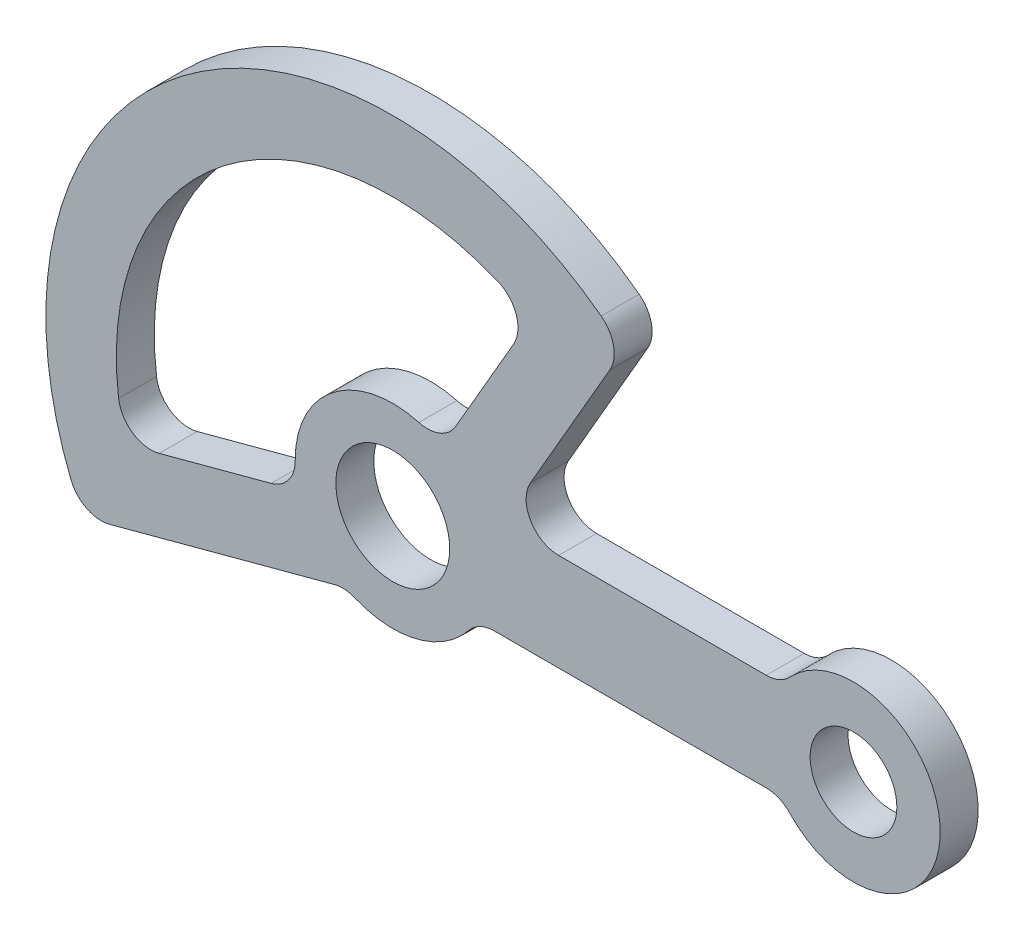
ISO-10303-21;
HEADER;
FILE_DESCRIPTION(('STEP AP214'),'2;1');
FILE_NAME('part.step','',(''),(''),'','','');
FILE_SCHEMA(('AUTOMOTIVE_DESIGN { 1 0 10303 214 1 1 1 1 }'));
ENDSEC;
DATA;
#1=APPLICATION_CONTEXT('core data for automotive mechanical design processes');
#2=APPLICATION_PROTOCOL_DEFINITION('international standard','automotive_design',2000,#1);
#3=PRODUCT_CONTEXT('',#1,'mechanical');
#4=PRODUCT('Part','Part','',(#3));
#5=PRODUCT_RELATED_PRODUCT_CATEGORY('part','',(#4));
#6=PRODUCT_DEFINITION_FORMATION('','',#4);
#7=PRODUCT_DEFINITION_CONTEXT('part definition',#1,'design');
#8=PRODUCT_DEFINITION('design','',#6,#7);
#9=PRODUCT_DEFINITION_SHAPE('','',#8);
#10=(LENGTH_UNIT() NAMED_UNIT(*) SI_UNIT(.MILLI.,.METRE.));
#11=(NAMED_UNIT(*) PLANE_ANGLE_UNIT() SI_UNIT($,.RADIAN.));
#12=(NAMED_UNIT(*) SI_UNIT($,.STERADIAN.) SOLID_ANGLE_UNIT());
#13=UNCERTAINTY_MEASURE_WITH_UNIT(LENGTH_MEASURE(1.E-05),#10,'distance_accuracy_value','');
#14=(GEOMETRIC_REPRESENTATION_CONTEXT(3) GLOBAL_UNCERTAINTY_ASSIGNED_CONTEXT((#13)) GLOBAL_UNIT_ASSIGNED_CONTEXT((#10,
#11,#12)) REPRESENTATION_CONTEXT('',''));
#15=CARTESIAN_POINT('',(0.,0.,0.));
#16=DIRECTION('',(0.,0.,1.));
#17=DIRECTION('',(1.,0.,0.));
#18=AXIS2_PLACEMENT_3D('',#15,#16,#17);
#19=CARTESIAN_POINT('',(68.9065230605689,15.,7.));
#20=DIRECTION('',(0.,0.,1.));
#21=DIRECTION('',(1.,0.,0.));
#22=AXIS2_PLACEMENT_3D('',#19,#20,#21);
#23=PLANE('',#22);
#24=DIRECTION('',(0.500000000000001,0.866025403784438,0.));
#25=VECTOR('',#24,1.);
#26=CARTESIAN_POINT('',(11.6189500386223,20.1246117974981,7.));
#27=LINE('',#26,#25);
#28=CARTESIAN_POINT('',(11.6189500386223,20.1246117974981,7.));
#29=VERTEX_POINT('',#28);
#30=CARTESIAN_POINT('',(22.2991031209778,38.6231795687512,7.));
#31=VERTEX_POINT('',#30);
#32=EDGE_CURVE('E200',#29,#31,#27,.T.);
#33=ORIENTED_EDGE('',*,*,#32,.F.);
#34=CARTESIAN_POINT('',(6.42279761591565,23.1246117974981,7.));
#35=DIRECTION('',(0.,0.,1.));
#36=DIRECTION('',(1.,0.,0.));
#37=AXIS2_PLACEMENT_3D('',#34,#35,#36);
#38=CIRCLE('',#37,6.);
#39=CARTESIAN_POINT('',(4.81709821193674,17.3434588481236,7.));
#40=VERTEX_POINT('',#39);
#41=EDGE_CURVE('E192',#40,#29,#38,.T.);
#42=ORIENTED_EDGE('',*,*,#41,.F.);
#43=CARTESIAN_POINT('',(0.,0.,7.));
#44=DIRECTION('',(0.,0.,-1.));
#45=DIRECTION('',(1.,0.,0.));
#46=AXIS2_PLACEMENT_3D('',#43,#44,#45);
#47=CIRCLE('',#46,18.);
#48=CARTESIAN_POINT('',(-17.9992515779627,-0.164142112834368,7.));
#49=VERTEX_POINT('',#48);
#50=EDGE_CURVE('E227',#49,#40,#47,.T.);
#51=ORIENTED_EDGE('',*,*,#50,.F.);
#52=CARTESIAN_POINT('',(-23.9990021039503,-0.218856150445824,7.));
#53=DIRECTION('',(0.,0.,1.));
#54=DIRECTION('',(1.,0.,0.));
#55=AXIS2_PLACEMENT_3D('',#52,#53,#54);
#56=CIRCLE('',#55,6.);
#57=CARTESIAN_POINT('',(-22.4460878333352,-6.01441110818023,7.));
#58=VERTEX_POINT('',#57);
#59=EDGE_CURVE('E225',#58,#49,#56,.T.);
#60=ORIENTED_EDGE('',*,*,#59,.F.);
#61=DIRECTION('',(0.965925826289068,0.258819045102522,0.));
#62=VECTOR('',#61,1.);
#63=CARTESIAN_POINT('',(-22.4460878333352,-6.01441110818023,7.));
#64=LINE('',#63,#62);
#65=CARTESIAN_POINT('',(-43.0785592152712,-11.5428651528282,7.));
#66=VERTEX_POINT('',#65);
#67=EDGE_CURVE('E223',#66,#58,#64,.T.);
#68=ORIENTED_EDGE('',*,*,#67,.F.);
#69=CARTESIAN_POINT('',(-44.6314734858863,-5.74731019509384,7.));
#70=DIRECTION('',(0.,0.,1.));
#71=DIRECTION('',(-1.,0.,0.));
#72=AXIS2_PLACEMENT_3D('',#69,#70,#71);
#73=CIRCLE('',#72,6.);
#74=CARTESIAN_POINT('',(-50.5823366173378,-6.51361822110635,7.));
#75=VERTEX_POINT('',#74);
#76=EDGE_CURVE('E221',#75,#66,#73,.T.);
#77=ORIENTED_EDGE('',*,*,#76,.F.);
#78=CARTESIAN_POINT('',(0.,0.,7.));
#79=DIRECTION('',(0.,0.,1.));
#80=DIRECTION('',(1.,0.,0.));
#81=AXIS2_PLACEMENT_3D('',#78,#79,#80);
#82=CIRCLE('',#81,51.);
#83=CARTESIAN_POINT('',(19.3833441247073,47.1729368445847,7.));
#84=VERTEX_POINT('',#83);
#85=EDGE_CURVE('E216',#84,#75,#82,.T.);
#86=ORIENTED_EDGE('',*,*,#85,.F.);
#87=CARTESIAN_POINT('',(17.1029506982712,41.6231795687512,7.));
#88=DIRECTION('',(0.,0.,1.));
#89=DIRECTION('',(1.,0.,0.));
#90=AXIS2_PLACEMENT_3D('',#87,#88,#89);
#91=CIRCLE('',#90,6.);
#92=EDGE_CURVE('E214',#31,#84,#91,.T.);
#93=ORIENTED_EDGE('',*,*,#92,.F.);
#94=EDGE_LOOP('',(#33,#42,#51,#60,#68,#77,#86,#93));
#95=FACE_BOUND('',#94,.T.);
#96=CARTESIAN_POINT('',(0.,0.,7.));
#97=DIRECTION('',(0.,0.,1.));
#98=DIRECTION('',(1.,0.,0.));
#99=AXIS2_PLACEMENT_3D('',#96,#97,#98);
#100=CIRCLE('',#99,10.5);
#101=CARTESIAN_POINT('',(10.5,0.,7.));
#102=VERTEX_POINT('',#101);
#103=EDGE_CURVE('E260',#102,#102,#100,.T.);
#104=ORIENTED_EDGE('',*,*,#103,.F.);
#105=EDGE_LOOP('',(#104));
#106=FACE_BOUND('',#105,.T.);
#107=CARTESIAN_POINT('',(68.9065230605689,15.,7.));
#108=DIRECTION('',(0.,0.,-1.));
#109=DIRECTION('',(1.,0.,0.));
#110=AXIS2_PLACEMENT_3D('',#107,#108,#109);
#111=CIRCLE('',#110,6.);
#112=CARTESIAN_POINT('',(73.2956531349592,10.9090909090909,7.));
#113=VERTEX_POINT('',#112);
#114=CARTESIAN_POINT('',(68.9065230605689,9.,7.));
#115=VERTEX_POINT('',#114);
#116=EDGE_CURVE('E266',#113,#115,#111,.T.);
#117=ORIENTED_EDGE('',*,*,#116,.T.);
#118=DIRECTION('',(-1.,0.,0.));
#119=VECTOR('',#118,1.);
#120=CARTESIAN_POINT('',(68.9065230605689,9.,7.));
#121=LINE('',#120,#119);
#122=CARTESIAN_POINT('',(30.5995642670503,8.99999999999999,7.));
#123=VERTEX_POINT('',#122);
#124=EDGE_CURVE('E269',#115,#123,#121,.T.);
#125=ORIENTED_EDGE('',*,*,#124,.T.);
#126=CARTESIAN_POINT('',(30.5995642670502,15.,7.));
#127=DIRECTION('',(0.,0.,-1.));
#128=DIRECTION('',(1.,0.,0.));
#129=AXIS2_PLACEMENT_3D('',#126,#127,#128);
#130=CIRCLE('',#129,6.);
#131=CARTESIAN_POINT('',(25.4034118443436,18.0000000000001,7.));
#132=VERTEX_POINT('',#131);
#133=EDGE_CURVE('E272',#123,#132,#130,.T.);
#134=ORIENTED_EDGE('',*,*,#133,.T.);
#135=DIRECTION('',(0.5,0.866025403784439,0.));
#136=VECTOR('',#135,1.);
#137=CARTESIAN_POINT('',(25.4034118443436,18.0000000000001,7.));
#138=LINE('',#137,#136);
#139=CARTESIAN_POINT('',(40.0463485901673,43.362310415784,7.));
#140=VERTEX_POINT('',#139);
#141=EDGE_CURVE('E274',#132,#140,#138,.T.);
#142=ORIENTED_EDGE('',*,*,#141,.T.);
#143=CARTESIAN_POINT('',(34.8501961674606,46.362310415784,7.));
#144=DIRECTION('',(0.,0.,1.));
#145=DIRECTION('',(1.,0.,0.));
#146=AXIS2_PLACEMENT_3D('',#143,#144,#145);
#147=CIRCLE('',#146,6.00000000000001);
#148=CARTESIAN_POINT('',(38.4553888744393,51.1584114932789,7.));
#149=VERTEX_POINT('',#148);
#150=EDGE_CURVE('E276',#140,#149,#147,.T.);
#151=ORIENTED_EDGE('',*,*,#150,.T.);
#152=CARTESIAN_POINT('',(0.,0.,7.));
#153=DIRECTION('',(0.,0.,1.));
#154=DIRECTION('',(1.,0.,0.));
#155=AXIS2_PLACEMENT_3D('',#152,#153,#154);
#156=CIRCLE('',#155,64.);
#157=CARTESIAN_POINT('',(-59.3682179208101,-23.904282062158,7.));
#158=VERTEX_POINT('',#157);
#159=EDGE_CURVE('E278',#149,#158,#156,.T.);
#160=ORIENTED_EDGE('',*,*,#159,.T.);
#161=CARTESIAN_POINT('',(-53.8024474907341,-21.6632556188307,7.));
#162=DIRECTION('',(0.,0.,1.));
#163=DIRECTION('',(1.,0.,0.));
#164=AXIS2_PLACEMENT_3D('',#161,#162,#163);
#165=CIRCLE('',#164,5.99999999999999);
#166=CARTESIAN_POINT('',(-52.249533220119,-27.4588105765651,7.));
#167=VERTEX_POINT('',#166);
#168=EDGE_CURVE('E280',#158,#167,#165,.T.);
#169=ORIENTED_EDGE('',*,*,#168,.T.);
#170=DIRECTION('',(0.965925826289068,0.258819045102522,0.));
#171=VECTOR('',#170,1.);
#172=CARTESIAN_POINT('',(-10.7986052500331,-16.35206790146,7.));
#173=LINE('',#172,#171);
#174=CARTESIAN_POINT('',(-10.7986052500331,-16.35206790146,7.));
#175=VERTEX_POINT('',#174);
#176=EDGE_CURVE('E282',#167,#175,#173,.T.);
#177=ORIENTED_EDGE('',*,*,#176,.T.);
#178=CARTESIAN_POINT('',(-9.245690979418,-22.1476228591944,7.));
#179=DIRECTION('',(0.,0.,-1.));
#180=DIRECTION('',(-1.,0.,0.));
#181=AXIS2_PLACEMENT_3D('',#178,#179,#180);
#182=CIRCLE('',#181,6.00000000000001);
#183=CARTESIAN_POINT('',(-6.9342682345635,-16.6107171443958,7.));
#184=VERTEX_POINT('',#183);
#185=EDGE_CURVE('E284',#175,#184,#182,.T.);
#186=ORIENTED_EDGE('',*,*,#185,.T.);
#187=CARTESIAN_POINT('',(0.,0.,7.));
#188=DIRECTION('',(0.,0.,1.));
#189=DIRECTION('',(1.,0.,0.));
#190=AXIS2_PLACEMENT_3D('',#187,#188,#189);
#191=CIRCLE('',#190,18.);
#192=CARTESIAN_POINT('',(14.0512454963964,-11.25,7.));
#193=VERTEX_POINT('',#192);
#194=EDGE_CURVE('E286',#184,#193,#191,.T.);
#195=ORIENTED_EDGE('',*,*,#194,.T.);
#196=CARTESIAN_POINT('',(18.7349939951952,-15.,7.));
#197=DIRECTION('',(0.,0.,-1.));
#198=DIRECTION('',(-1.,0.,0.));
#199=AXIS2_PLACEMENT_3D('',#196,#197,#198);
#200=CIRCLE('',#199,6.);
#201=CARTESIAN_POINT('',(18.7349939951952,-9.,7.));
#202=VERTEX_POINT('',#201);
#203=EDGE_CURVE('E288',#193,#202,#200,.T.);
#204=ORIENTED_EDGE('',*,*,#203,.T.);
#205=DIRECTION('',(1.,0.,0.));
#206=VECTOR('',#205,1.);
#207=CARTESIAN_POINT('',(68.9065230605689,-9.,7.));
#208=LINE('',#207,#206);
#209=CARTESIAN_POINT('',(68.9065230605689,-8.99999999999999,7.));
#210=VERTEX_POINT('',#209);
#211=EDGE_CURVE('E290',#202,#210,#208,.T.);
#212=ORIENTED_EDGE('',*,*,#211,.T.);
#213=CARTESIAN_POINT('',(68.9065230605689,-15.,7.));
#214=DIRECTION('',(0.,0.,-1.));
#215=DIRECTION('',(-1.,0.,0.));
#216=AXIS2_PLACEMENT_3D('',#213,#214,#215);
#217=CIRCLE('',#216,6.);
#218=CARTESIAN_POINT('',(73.2956531349592,-10.9090909090909,7.));
#219=VERTEX_POINT('',#218);
#220=EDGE_CURVE('E292',#210,#219,#217,.T.);
#221=ORIENTED_EDGE('',*,*,#220,.T.);
#222=CARTESIAN_POINT('',(85.,0.,7.));
#223=DIRECTION('',(0.,0.,1.));
#224=DIRECTION('',(1.,0.,0.));
#225=AXIS2_PLACEMENT_3D('',#222,#223,#224);
#226=CIRCLE('',#225,16.);
#227=EDGE_CURVE('E294',#219,#113,#226,.T.);
#228=ORIENTED_EDGE('',*,*,#227,.T.);
#229=EDGE_LOOP('',(#117,#125,#134,#142,#151,#160,#169,#177,#186,#195,#204,#212,#221,#228));
#230=FACE_BOUND('',#229,.T.);
#231=CARTESIAN_POINT('',(85.,0.,7.));
#232=DIRECTION('',(0.,0.,1.));
#233=DIRECTION('',(1.,0.,0.));
#234=AXIS2_PLACEMENT_3D('',#231,#232,#233);
#235=CIRCLE('',#234,8.00000000000001);
#236=CARTESIAN_POINT('',(93.,0.,7.));
#237=VERTEX_POINT('',#236);
#238=EDGE_CURVE('E230',#237,#237,#235,.T.);
#239=ORIENTED_EDGE('',*,*,#238,.F.);
#240=EDGE_LOOP('',(#239));
#241=FACE_BOUND('',#240,.T.);
#242=ADVANCED_FACE('F43',(#95,#106,#230,#241),#23,.T.);
#243=CARTESIAN_POINT('',(68.9065230605689,15.,0.));
#244=DIRECTION('',(0.,0.,1.));
#245=DIRECTION('',(1.,0.,0.));
#246=AXIS2_PLACEMENT_3D('',#243,#244,#245);
#247=PLANE('',#246);
#248=CARTESIAN_POINT('',(0.,0.,0.));
#249=DIRECTION('',(0.,0.,1.));
#250=DIRECTION('',(1.,0.,0.));
#251=AXIS2_PLACEMENT_3D('',#248,#249,#250);
#252=CIRCLE('',#251,10.5);
#253=CARTESIAN_POINT('',(10.5,0.,0.));
#254=VERTEX_POINT('',#253);
#255=EDGE_CURVE('E208',#254,#254,#252,.T.);
#256=ORIENTED_EDGE('',*,*,#255,.T.);
#257=EDGE_LOOP('',(#256));
#258=FACE_BOUND('',#257,.T.);
#259=CARTESIAN_POINT('',(68.9065230605689,15.,0.));
#260=DIRECTION('',(0.,0.,-1.));
#261=DIRECTION('',(1.,0.,0.));
#262=AXIS2_PLACEMENT_3D('',#259,#260,#261);
#263=CIRCLE('',#262,6.);
#264=CARTESIAN_POINT('',(73.2956531349592,10.9090909090909,0.));
#265=VERTEX_POINT('',#264);
#266=CARTESIAN_POINT('',(68.9065230605689,9.,0.));
#267=VERTEX_POINT('',#266);
#268=EDGE_CURVE('E263',#265,#267,#263,.T.);
#269=ORIENTED_EDGE('',*,*,#268,.F.);
#270=CARTESIAN_POINT('',(85.,0.,0.));
#271=DIRECTION('',(0.,0.,1.));
#272=DIRECTION('',(1.,0.,0.));
#273=AXIS2_PLACEMENT_3D('',#270,#271,#272);
#274=CIRCLE('',#273,16.);
#275=CARTESIAN_POINT('',(73.2956531349592,-10.9090909090909,0.));
#276=VERTEX_POINT('',#275);
#277=EDGE_CURVE('E270',#276,#265,#274,.T.);
#278=ORIENTED_EDGE('',*,*,#277,.F.);
#279=CARTESIAN_POINT('',(68.9065230605689,-15.,0.));
#280=DIRECTION('',(0.,0.,-1.));
#281=DIRECTION('',(-1.,0.,0.));
#282=AXIS2_PLACEMENT_3D('',#279,#280,#281);
#283=CIRCLE('',#282,6.);
#284=CARTESIAN_POINT('',(68.9065230605689,-8.99999999999999,0.));
#285=VERTEX_POINT('',#284);
#286=EDGE_CURVE('E321',#285,#276,#283,.T.);
#287=ORIENTED_EDGE('',*,*,#286,.F.);
#288=DIRECTION('',(1.,0.,0.));
#289=VECTOR('',#288,1.);
#290=CARTESIAN_POINT('',(68.9065230605689,-9.,0.));
#291=LINE('',#290,#289);
#292=CARTESIAN_POINT('',(18.7349939951952,-9.,0.));
#293=VERTEX_POINT('',#292);
#294=EDGE_CURVE('E319',#293,#285,#291,.T.);
#295=ORIENTED_EDGE('',*,*,#294,.F.);
#296=CARTESIAN_POINT('',(18.7349939951952,-15.,0.));
#297=DIRECTION('',(0.,0.,-1.));
#298=DIRECTION('',(-1.,0.,0.));
#299=AXIS2_PLACEMENT_3D('',#296,#297,#298);
#300=CIRCLE('',#299,6.);
#301=CARTESIAN_POINT('',(14.0512454963964,-11.25,0.));
#302=VERTEX_POINT('',#301);
#303=EDGE_CURVE('E317',#302,#293,#300,.T.);
#304=ORIENTED_EDGE('',*,*,#303,.F.);
#305=CARTESIAN_POINT('',(0.,0.,0.));
#306=DIRECTION('',(0.,0.,1.));
#307=DIRECTION('',(1.,0.,0.));
#308=AXIS2_PLACEMENT_3D('',#305,#306,#307);
#309=CIRCLE('',#308,18.);
#310=CARTESIAN_POINT('',(-6.9342682345635,-16.6107171443958,0.));
#311=VERTEX_POINT('',#310);
#312=EDGE_CURVE('E315',#311,#302,#309,.T.);
#313=ORIENTED_EDGE('',*,*,#312,.F.);
#314=CARTESIAN_POINT('',(-9.245690979418,-22.1476228591944,0.));
#315=DIRECTION('',(0.,0.,-1.));
#316=DIRECTION('',(-1.,0.,0.));
#317=AXIS2_PLACEMENT_3D('',#314,#315,#316);
#318=CIRCLE('',#317,6.00000000000001);
#319=CARTESIAN_POINT('',(-10.7986052500331,-16.35206790146,0.));
#320=VERTEX_POINT('',#319);
#321=EDGE_CURVE('E313',#320,#311,#318,.T.);
#322=ORIENTED_EDGE('',*,*,#321,.F.);
#323=DIRECTION('',(0.965925826289068,0.258819045102522,0.));
#324=VECTOR('',#323,1.);
#325=CARTESIAN_POINT('',(-10.7986052500331,-16.35206790146,0.));
#326=LINE('',#325,#324);
#327=CARTESIAN_POINT('',(-52.249533220119,-27.4588105765651,0.));
#328=VERTEX_POINT('',#327);
#329=EDGE_CURVE('E311',#328,#320,#326,.T.);
#330=ORIENTED_EDGE('',*,*,#329,.F.);
#331=CARTESIAN_POINT('',(-53.8024474907341,-21.6632556188307,0.));
#332=DIRECTION('',(0.,0.,1.));
#333=DIRECTION('',(1.,0.,0.));
#334=AXIS2_PLACEMENT_3D('',#331,#332,#333);
#335=CIRCLE('',#334,5.99999999999999);
#336=CARTESIAN_POINT('',(-59.3682179208101,-23.904282062158,0.));
#337=VERTEX_POINT('',#336);
#338=EDGE_CURVE('E309',#337,#328,#335,.T.);
#339=ORIENTED_EDGE('',*,*,#338,.F.);
#340=CARTESIAN_POINT('',(0.,0.,0.));
#341=DIRECTION('',(0.,0.,1.));
#342=DIRECTION('',(1.,0.,0.));
#343=AXIS2_PLACEMENT_3D('',#340,#341,#342);
#344=CIRCLE('',#343,64.);
#345=CARTESIAN_POINT('',(38.4553888744393,51.1584114932789,0.));
#346=VERTEX_POINT('',#345);
#347=EDGE_CURVE('E307',#346,#337,#344,.T.);
#348=ORIENTED_EDGE('',*,*,#347,.F.);
#349=CARTESIAN_POINT('',(34.8501961674606,46.362310415784,0.));
#350=DIRECTION('',(0.,0.,1.));
#351=DIRECTION('',(1.,0.,0.));
#352=AXIS2_PLACEMENT_3D('',#349,#350,#351);
#353=CIRCLE('',#352,6.00000000000001);
#354=CARTESIAN_POINT('',(40.0463485901673,43.362310415784,0.));
#355=VERTEX_POINT('',#354);
#356=EDGE_CURVE('E305',#355,#346,#353,.T.);
#357=ORIENTED_EDGE('',*,*,#356,.F.);
#358=DIRECTION('',(0.5,0.866025403784439,0.));
#359=VECTOR('',#358,1.);
#360=CARTESIAN_POINT('',(25.4034118443436,18.0000000000001,0.));
#361=LINE('',#360,#359);
#362=CARTESIAN_POINT('',(25.4034118443436,18.0000000000001,0.));
#363=VERTEX_POINT('',#362);
#364=EDGE_CURVE('E303',#363,#355,#361,.T.);
#365=ORIENTED_EDGE('',*,*,#364,.F.);
#366=CARTESIAN_POINT('',(30.5995642670502,15.,0.));
#367=DIRECTION('',(0.,0.,-1.));
#368=DIRECTION('',(1.,0.,0.));
#369=AXIS2_PLACEMENT_3D('',#366,#367,#368);
#370=CIRCLE('',#369,6.);
#371=CARTESIAN_POINT('',(30.5995642670503,8.99999999999999,0.));
#372=VERTEX_POINT('',#371);
#373=EDGE_CURVE('E301',#372,#363,#370,.T.);
#374=ORIENTED_EDGE('',*,*,#373,.F.);
#375=DIRECTION('',(-1.,0.,0.));
#376=VECTOR('',#375,1.);
#377=CARTESIAN_POINT('',(68.9065230605689,9.,0.));
#378=LINE('',#377,#376);
#379=EDGE_CURVE('E299',#267,#372,#378,.T.);
#380=ORIENTED_EDGE('',*,*,#379,.F.);
#381=EDGE_LOOP('',(#269,#278,#287,#295,#304,#313,#322,#330,#339,#348,#357,#365,#374,#380));
#382=FACE_BOUND('',#381,.T.);
#383=CARTESIAN_POINT('',(6.42279761591565,23.1246117974981,0.));
#384=DIRECTION('',(0.,0.,1.));
#385=DIRECTION('',(1.,0.,0.));
#386=AXIS2_PLACEMENT_3D('',#383,#384,#385);
#387=CIRCLE('',#386,6.);
#388=CARTESIAN_POINT('',(4.81709821193674,17.3434588481236,0.));
#389=VERTEX_POINT('',#388);
#390=CARTESIAN_POINT('',(11.6189500386223,20.1246117974981,0.));
#391=VERTEX_POINT('',#390);
#392=EDGE_CURVE('E66',#389,#391,#387,.T.);
#393=ORIENTED_EDGE('',*,*,#392,.T.);
#394=DIRECTION('',(0.500000000000001,0.866025403784438,0.));
#395=VECTOR('',#394,1.);
#396=CARTESIAN_POINT('',(11.6189500386223,20.1246117974981,0.));
#397=LINE('',#396,#395);
#398=CARTESIAN_POINT('',(22.2991031209778,38.6231795687512,0.));
#399=VERTEX_POINT('',#398);
#400=EDGE_CURVE('E207',#391,#399,#397,.T.);
#401=ORIENTED_EDGE('',*,*,#400,.T.);
#402=CARTESIAN_POINT('',(17.1029506982712,41.6231795687512,0.));
#403=DIRECTION('',(0.,0.,1.));
#404=DIRECTION('',(1.,0.,0.));
#405=AXIS2_PLACEMENT_3D('',#402,#403,#404);
#406=CIRCLE('',#405,6.);
#407=CARTESIAN_POINT('',(19.3833441247073,47.1729368445847,0.));
#408=VERTEX_POINT('',#407);
#409=EDGE_CURVE('E232',#399,#408,#406,.T.);
#410=ORIENTED_EDGE('',*,*,#409,.T.);
#411=CARTESIAN_POINT('',(0.,0.,0.));
#412=DIRECTION('',(0.,0.,1.));
#413=DIRECTION('',(1.,0.,0.));
#414=AXIS2_PLACEMENT_3D('',#411,#412,#413);
#415=CIRCLE('',#414,51.);
#416=CARTESIAN_POINT('',(-50.5823366173378,-6.51361822110635,0.));
#417=VERTEX_POINT('',#416);
#418=EDGE_CURVE('E235',#408,#417,#415,.T.);
#419=ORIENTED_EDGE('',*,*,#418,.T.);
#420=CARTESIAN_POINT('',(-44.6314734858863,-5.74731019509384,0.));
#421=DIRECTION('',(0.,0.,1.));
#422=DIRECTION('',(-1.,0.,0.));
#423=AXIS2_PLACEMENT_3D('',#420,#421,#422);
#424=CIRCLE('',#423,6.);
#425=CARTESIAN_POINT('',(-43.0785592152712,-11.5428651528282,0.));
#426=VERTEX_POINT('',#425);
#427=EDGE_CURVE('E238',#417,#426,#424,.T.);
#428=ORIENTED_EDGE('',*,*,#427,.T.);
#429=DIRECTION('',(0.965925826289068,0.258819045102522,0.));
#430=VECTOR('',#429,1.);
#431=CARTESIAN_POINT('',(-22.4460878333352,-6.01441110818023,0.));
#432=LINE('',#431,#430);
#433=CARTESIAN_POINT('',(-22.4460878333352,-6.01441110818023,0.));
#434=VERTEX_POINT('',#433);
#435=EDGE_CURVE('E241',#426,#434,#432,.T.);
#436=ORIENTED_EDGE('',*,*,#435,.T.);
#437=CARTESIAN_POINT('',(-23.9990021039503,-0.218856150445824,0.));
#438=DIRECTION('',(0.,0.,1.));
#439=DIRECTION('',(1.,0.,0.));
#440=AXIS2_PLACEMENT_3D('',#437,#438,#439);
#441=CIRCLE('',#440,6.);
#442=CARTESIAN_POINT('',(-17.9992515779627,-0.164142112834368,0.));
#443=VERTEX_POINT('',#442);
#444=EDGE_CURVE('E244',#434,#443,#441,.T.);
#445=ORIENTED_EDGE('',*,*,#444,.T.);
#446=CARTESIAN_POINT('',(0.,0.,0.));
#447=DIRECTION('',(0.,0.,-1.));
#448=DIRECTION('',(1.,0.,0.));
#449=AXIS2_PLACEMENT_3D('',#446,#447,#448);
#450=CIRCLE('',#449,18.);
#451=EDGE_CURVE('E201',#443,#389,#450,.T.);
#452=ORIENTED_EDGE('',*,*,#451,.T.);
#453=EDGE_LOOP('',(#393,#401,#410,#419,#428,#436,#445,#452));
#454=FACE_BOUND('',#453,.T.);
#455=CARTESIAN_POINT('',(85.,0.,0.));
#456=DIRECTION('',(0.,0.,1.));
#457=DIRECTION('',(1.,0.,0.));
#458=AXIS2_PLACEMENT_3D('',#455,#456,#457);
#459=CIRCLE('',#458,8.00000000000001);
#460=CARTESIAN_POINT('',(93.,0.,0.));
#461=VERTEX_POINT('',#460);
#462=EDGE_CURVE('E658',#461,#461,#459,.T.);
#463=ORIENTED_EDGE('',*,*,#462,.T.);
#464=EDGE_LOOP('',(#463));
#465=FACE_BOUND('',#464,.T.);
#466=ADVANCED_FACE('F369',(#258,#382,#454,#465),#247,.F.);
#467=CARTESIAN_POINT('',(68.9065230605689,15.,7.));
#468=DIRECTION('',(0.,0.,-1.));
#469=DIRECTION('',(-1.,0.,0.));
#470=AXIS2_PLACEMENT_3D('',#467,#468,#469);
#471=CYLINDRICAL_SURFACE('',#470,6.);
#472=ORIENTED_EDGE('',*,*,#268,.T.);
#473=DIRECTION('',(0.,0.,-1.));
#474=VECTOR('',#473,1.);
#475=CARTESIAN_POINT('',(68.9065230605689,9.,7.));
#476=LINE('',#475,#474);
#477=EDGE_CURVE('E11',#115,#267,#476,.T.);
#478=ORIENTED_EDGE('',*,*,#477,.F.);
#479=ORIENTED_EDGE('',*,*,#116,.F.);
#480=DIRECTION('',(0.,0.,-1.));
#481=VECTOR('',#480,1.);
#482=CARTESIAN_POINT('',(73.2956531349592,10.9090909090909,7.));
#483=LINE('',#482,#481);
#484=EDGE_CURVE('E296',#113,#265,#483,.T.);
#485=ORIENTED_EDGE('',*,*,#484,.T.);
#486=EDGE_LOOP('',(#472,#478,#479,#485));
#487=FACE_BOUND('',#486,.T.);
#488=ADVANCED_FACE('F45',(#487),#471,.F.);
#489=CARTESIAN_POINT('',(68.9065230605689,9.,7.));
#490=DIRECTION('',(0.,-1.,0.));
#491=DIRECTION('',(1.,0.,0.));
#492=AXIS2_PLACEMENT_3D('',#489,#490,#491);
#493=PLANE('',#492);
#494=ORIENTED_EDGE('',*,*,#379,.T.);
#495=DIRECTION('',(0.,0.,-1.));
#496=VECTOR('',#495,1.);
#497=CARTESIAN_POINT('',(30.5995642670503,8.99999999999999,7.));
#498=LINE('',#497,#496);
#499=EDGE_CURVE('E51',#123,#372,#498,.T.);
#500=ORIENTED_EDGE('',*,*,#499,.F.);
#501=ORIENTED_EDGE('',*,*,#124,.F.);
#502=ORIENTED_EDGE('',*,*,#477,.T.);
#503=EDGE_LOOP('',(#494,#500,#501,#502));
#504=FACE_BOUND('',#503,.T.);
#505=ADVANCED_FACE('F387',(#504),#493,.F.);
#506=CARTESIAN_POINT('',(30.5995642670502,15.,7.));
#507=DIRECTION('',(0.,0.,-1.));
#508=DIRECTION('',(-1.,0.,0.));
#509=AXIS2_PLACEMENT_3D('',#506,#507,#508);
#510=CYLINDRICAL_SURFACE('',#509,6.);
#511=ORIENTED_EDGE('',*,*,#373,.T.);
#512=DIRECTION('',(0.,0.,-1.));
#513=VECTOR('',#512,1.);
#514=CARTESIAN_POINT('',(25.4034118443436,18.0000000000001,7.));
#515=LINE('',#514,#513);
#516=EDGE_CURVE('E356',#132,#363,#515,.T.);
#517=ORIENTED_EDGE('',*,*,#516,.F.);
#518=ORIENTED_EDGE('',*,*,#133,.F.);
#519=ORIENTED_EDGE('',*,*,#499,.T.);
#520=EDGE_LOOP('',(#511,#517,#518,#519));
#521=FACE_BOUND('',#520,.T.);
#522=ADVANCED_FACE('F363',(#521),#510,.F.);
#523=CARTESIAN_POINT('',(25.4034118443436,18.0000000000001,7.));
#524=DIRECTION('',(-0.866025403784439,0.5,0.));
#525=DIRECTION('',(-0.5,-0.866025403784439,0.));
#526=AXIS2_PLACEMENT_3D('',#523,#524,#525);
#527=PLANE('',#526);
#528=ORIENTED_EDGE('',*,*,#364,.T.);
#529=DIRECTION('',(0.,0.,-1.));
#530=VECTOR('',#529,1.);
#531=CARTESIAN_POINT('',(40.0463485901673,43.362310415784,7.));
#532=LINE('',#531,#530);
#533=EDGE_CURVE('E353',#140,#355,#532,.T.);
#534=ORIENTED_EDGE('',*,*,#533,.F.);
#535=ORIENTED_EDGE('',*,*,#141,.F.);
#536=ORIENTED_EDGE('',*,*,#516,.T.);
#537=EDGE_LOOP('',(#528,#534,#535,#536));
#538=FACE_BOUND('',#537,.T.);
#539=ADVANCED_FACE('F375',(#538),#527,.F.);
#540=CARTESIAN_POINT('',(34.8501961674606,46.362310415784,7.));
#541=DIRECTION('',(0.,0.,-1.));
#542=DIRECTION('',(-1.,0.,0.));
#543=AXIS2_PLACEMENT_3D('',#540,#541,#542);
#544=CYLINDRICAL_SURFACE('',#543,6.00000000000001);
#545=ORIENTED_EDGE('',*,*,#356,.T.);
#546=DIRECTION('',(0.,0.,-1.));
#547=VECTOR('',#546,1.);
#548=CARTESIAN_POINT('',(38.4553888744393,51.1584114932789,7.));
#549=LINE('',#548,#547);
#550=EDGE_CURVE('E350',#149,#346,#549,.T.);
#551=ORIENTED_EDGE('',*,*,#550,.F.);
#552=ORIENTED_EDGE('',*,*,#150,.F.);
#553=ORIENTED_EDGE('',*,*,#533,.T.);
#554=EDGE_LOOP('',(#545,#551,#552,#553));
#555=FACE_BOUND('',#554,.T.);
#556=ADVANCED_FACE('F379',(#555),#544,.T.);
#557=CARTESIAN_POINT('',(0.,0.,7.));
#558=DIRECTION('',(0.,0.,-1.));
#559=DIRECTION('',(-1.,0.,0.));
#560=AXIS2_PLACEMENT_3D('',#557,#558,#559);
#561=CYLINDRICAL_SURFACE('',#560,64.);
#562=ORIENTED_EDGE('',*,*,#347,.T.);
#563=DIRECTION('',(0.,0.,-1.));
#564=VECTOR('',#563,1.);
#565=CARTESIAN_POINT('',(-59.3682179208101,-23.904282062158,7.));
#566=LINE('',#565,#564);
#567=EDGE_CURVE('E347',#158,#337,#566,.T.);
#568=ORIENTED_EDGE('',*,*,#567,.F.);
#569=ORIENTED_EDGE('',*,*,#159,.F.);
#570=ORIENTED_EDGE('',*,*,#550,.T.);
#571=EDGE_LOOP('',(#562,#568,#569,#570));
#572=FACE_BOUND('',#571,.T.);
#573=ADVANCED_FACE('F430',(#572),#561,.T.);
#574=CARTESIAN_POINT('',(-53.8024474907341,-21.6632556188307,7.));
#575=DIRECTION('',(0.,0.,-1.));
#576=DIRECTION('',(-1.,0.,0.));
#577=AXIS2_PLACEMENT_3D('',#574,#575,#576);
#578=CYLINDRICAL_SURFACE('',#577,5.99999999999999);
#579=ORIENTED_EDGE('',*,*,#338,.T.);
#580=DIRECTION('',(0.,0.,-1.));
#581=VECTOR('',#580,1.);
#582=CARTESIAN_POINT('',(-52.249533220119,-27.4588105765651,7.));
#583=LINE('',#582,#581);
#584=EDGE_CURVE('E344',#167,#328,#583,.T.);
#585=ORIENTED_EDGE('',*,*,#584,.F.);
#586=ORIENTED_EDGE('',*,*,#168,.F.);
#587=ORIENTED_EDGE('',*,*,#567,.T.);
#588=EDGE_LOOP('',(#579,#585,#586,#587));
#589=FACE_BOUND('',#588,.T.);
#590=ADVANCED_FACE('F428',(#589),#578,.T.);
#591=CARTESIAN_POINT('',(-10.7986052500331,-16.35206790146,7.));
#592=DIRECTION('',(-0.258819045102522,0.965925826289068,0.));
#593=DIRECTION('',(-0.965925826289068,-0.258819045102522,0.));
#594=AXIS2_PLACEMENT_3D('',#591,#592,#593);
#595=PLANE('',#594);
#596=ORIENTED_EDGE('',*,*,#329,.T.);
#597=DIRECTION('',(0.,0.,-1.));
#598=VECTOR('',#597,1.);
#599=CARTESIAN_POINT('',(-10.7986052500331,-16.35206790146,7.));
#600=LINE('',#599,#598);
#601=EDGE_CURVE('E341',#175,#320,#600,.T.);
#602=ORIENTED_EDGE('',*,*,#601,.F.);
#603=ORIENTED_EDGE('',*,*,#176,.F.);
#604=ORIENTED_EDGE('',*,*,#584,.T.);
#605=EDGE_LOOP('',(#596,#602,#603,#604));
#606=FACE_BOUND('',#605,.T.);
#607=ADVANCED_FACE('F423',(#606),#595,.F.);
#608=CARTESIAN_POINT('',(-9.245690979418,-22.1476228591944,7.));
#609=DIRECTION('',(0.,0.,-1.));
#610=DIRECTION('',(-1.,0.,0.));
#611=AXIS2_PLACEMENT_3D('',#608,#609,#610);
#612=CYLINDRICAL_SURFACE('',#611,6.00000000000001);
#613=ORIENTED_EDGE('',*,*,#321,.T.);
#614=DIRECTION('',(0.,0.,-1.));
#615=VECTOR('',#614,1.);
#616=CARTESIAN_POINT('',(-6.9342682345635,-16.6107171443958,7.));
#617=LINE('',#616,#615);
#618=EDGE_CURVE('E338',#184,#311,#617,.T.);
#619=ORIENTED_EDGE('',*,*,#618,.F.);
#620=ORIENTED_EDGE('',*,*,#185,.F.);
#621=ORIENTED_EDGE('',*,*,#601,.T.);
#622=EDGE_LOOP('',(#613,#619,#620,#621));
#623=FACE_BOUND('',#622,.T.);
#624=ADVANCED_FACE('F418',(#623),#612,.F.);
#625=CARTESIAN_POINT('',(0.,0.,7.));
#626=DIRECTION('',(0.,0.,-1.));
#627=DIRECTION('',(-1.,0.,0.));
#628=AXIS2_PLACEMENT_3D('',#625,#626,#627);
#629=CYLINDRICAL_SURFACE('',#628,18.);
#630=ORIENTED_EDGE('',*,*,#312,.T.);
#631=DIRECTION('',(0.,0.,-1.));
#632=VECTOR('',#631,1.);
#633=CARTESIAN_POINT('',(14.0512454963964,-11.25,7.));
#634=LINE('',#633,#632);
#635=EDGE_CURVE('E335',#193,#302,#634,.T.);
#636=ORIENTED_EDGE('',*,*,#635,.F.);
#637=ORIENTED_EDGE('',*,*,#194,.F.);
#638=ORIENTED_EDGE('',*,*,#618,.T.);
#639=EDGE_LOOP('',(#630,#636,#637,#638));
#640=FACE_BOUND('',#639,.T.);
#641=ADVANCED_FACE('F414',(#640),#629,.T.);
#642=CARTESIAN_POINT('',(18.7349939951952,-15.,7.));
#643=DIRECTION('',(0.,0.,-1.));
#644=DIRECTION('',(-1.,0.,0.));
#645=AXIS2_PLACEMENT_3D('',#642,#643,#644);
#646=CYLINDRICAL_SURFACE('',#645,6.);
#647=ORIENTED_EDGE('',*,*,#303,.T.);
#648=DIRECTION('',(0.,0.,-1.));
#649=VECTOR('',#648,1.);
#650=CARTESIAN_POINT('',(18.7349939951952,-9.,7.));
#651=LINE('',#650,#649);
#652=EDGE_CURVE('E332',#202,#293,#651,.T.);
#653=ORIENTED_EDGE('',*,*,#652,.F.);
#654=ORIENTED_EDGE('',*,*,#203,.F.);
#655=ORIENTED_EDGE('',*,*,#635,.T.);
#656=EDGE_LOOP('',(#647,#653,#654,#655));
#657=FACE_BOUND('',#656,.T.);
#658=ADVANCED_FACE('F409',(#657),#646,.F.);
#659=CARTESIAN_POINT('',(68.9065230605689,-9.,7.));
#660=DIRECTION('',(0.,1.,0.));
#661=DIRECTION('',(-1.,0.,0.));
#662=AXIS2_PLACEMENT_3D('',#659,#660,#661);
#663=PLANE('',#662);
#664=ORIENTED_EDGE('',*,*,#294,.T.);
#665=DIRECTION('',(0.,0.,-1.));
#666=VECTOR('',#665,1.);
#667=CARTESIAN_POINT('',(68.9065230605689,-8.99999999999999,7.));
#668=LINE('',#667,#666);
#669=EDGE_CURVE('E329',#210,#285,#668,.T.);
#670=ORIENTED_EDGE('',*,*,#669,.F.);
#671=ORIENTED_EDGE('',*,*,#211,.F.);
#672=ORIENTED_EDGE('',*,*,#652,.T.);
#673=EDGE_LOOP('',(#664,#670,#671,#672));
#674=FACE_BOUND('',#673,.T.);
#675=ADVANCED_FACE('F403',(#674),#663,.F.);
#676=CARTESIAN_POINT('',(68.9065230605689,-15.,7.));
#677=DIRECTION('',(0.,0.,-1.));
#678=DIRECTION('',(-1.,0.,0.));
#679=AXIS2_PLACEMENT_3D('',#676,#677,#678);
#680=CYLINDRICAL_SURFACE('',#679,6.);
#681=ORIENTED_EDGE('',*,*,#286,.T.);
#682=DIRECTION('',(0.,0.,-1.));
#683=VECTOR('',#682,1.);
#684=CARTESIAN_POINT('',(73.2956531349592,-10.9090909090909,7.));
#685=LINE('',#684,#683);
#686=EDGE_CURVE('E326',#219,#276,#685,.T.);
#687=ORIENTED_EDGE('',*,*,#686,.F.);
#688=ORIENTED_EDGE('',*,*,#220,.F.);
#689=ORIENTED_EDGE('',*,*,#669,.T.);
#690=EDGE_LOOP('',(#681,#687,#688,#689));
#691=FACE_BOUND('',#690,.T.);
#692=ADVANCED_FACE('F399',(#691),#680,.F.);
#693=CARTESIAN_POINT('',(85.,0.,7.));
#694=DIRECTION('',(0.,0.,-1.));
#695=DIRECTION('',(-1.,0.,0.));
#696=AXIS2_PLACEMENT_3D('',#693,#694,#695);
#697=CYLINDRICAL_SURFACE('',#696,16.);
#698=ORIENTED_EDGE('',*,*,#277,.T.);
#699=ORIENTED_EDGE('',*,*,#484,.F.);
#700=ORIENTED_EDGE('',*,*,#227,.F.);
#701=ORIENTED_EDGE('',*,*,#686,.T.);
#702=EDGE_LOOP('',(#698,#699,#700,#701));
#703=FACE_BOUND('',#702,.T.);
#704=ADVANCED_FACE('F394',(#703),#697,.T.);
#705=CARTESIAN_POINT('',(0.,0.,7.));
#706=DIRECTION('',(0.,0.,-1.));
#707=DIRECTION('',(-1.,0.,0.));
#708=AXIS2_PLACEMENT_3D('',#705,#706,#707);
#709=CYLINDRICAL_SURFACE('',#708,10.5);
#710=ORIENTED_EDGE('',*,*,#103,.T.);
#711=EDGE_LOOP('',(#710));
#712=FACE_BOUND('',#711,.T.);
#713=ORIENTED_EDGE('',*,*,#255,.F.);
#714=EDGE_LOOP('',(#713));
#715=FACE_BOUND('',#714,.T.);
#716=ADVANCED_FACE('F447',(#712,#715),#709,.F.);
#717=CARTESIAN_POINT('',(6.42279761591565,23.1246117974981,7.));
#718=DIRECTION('',(0.,0.,-1.));
#719=DIRECTION('',(-1.,0.,0.));
#720=AXIS2_PLACEMENT_3D('',#717,#718,#719);
#721=CYLINDRICAL_SURFACE('',#720,6.);
#722=ORIENTED_EDGE('',*,*,#392,.F.);
#723=DIRECTION('',(0.,0.,-1.));
#724=VECTOR('',#723,1.);
#725=CARTESIAN_POINT('',(4.81709821193674,17.3434588481236,7.));
#726=LINE('',#725,#724);
#727=EDGE_CURVE('E196',#40,#389,#726,.T.);
#728=ORIENTED_EDGE('',*,*,#727,.F.);
#729=ORIENTED_EDGE('',*,*,#41,.T.);
#730=DIRECTION('',(0.,0.,-1.));
#731=VECTOR('',#730,1.);
#732=CARTESIAN_POINT('',(11.6189500386223,20.1246117974981,7.));
#733=LINE('',#732,#731);
#734=EDGE_CURVE('E195',#29,#391,#733,.T.);
#735=ORIENTED_EDGE('',*,*,#734,.T.);
#736=EDGE_LOOP('',(#722,#728,#729,#735));
#737=FACE_BOUND('',#736,.T.);
#738=ADVANCED_FACE('F194',(#737),#721,.F.);
#739=CARTESIAN_POINT('',(11.6189500386223,20.1246117974981,7.));
#740=DIRECTION('',(-0.866025403784438,0.500000000000001,0.));
#741=DIRECTION('',(-0.500000000000001,-0.866025403784438,0.));
#742=AXIS2_PLACEMENT_3D('',#739,#740,#741);
#743=PLANE('',#742);
#744=ORIENTED_EDGE('',*,*,#400,.F.);
#745=ORIENTED_EDGE('',*,*,#734,.F.);
#746=ORIENTED_EDGE('',*,*,#32,.T.);
#747=DIRECTION('',(0.,0.,-1.));
#748=VECTOR('',#747,1.);
#749=CARTESIAN_POINT('',(22.2991031209778,38.6231795687512,7.));
#750=LINE('',#749,#748);
#751=EDGE_CURVE('E209',#31,#399,#750,.T.);
#752=ORIENTED_EDGE('',*,*,#751,.T.);
#753=EDGE_LOOP('',(#744,#745,#746,#752));
#754=FACE_BOUND('',#753,.T.);
#755=ADVANCED_FACE('F204',(#754),#743,.T.);
#756=CARTESIAN_POINT('',(17.1029506982712,41.6231795687512,7.));
#757=DIRECTION('',(0.,0.,-1.));
#758=DIRECTION('',(-1.,0.,0.));
#759=AXIS2_PLACEMENT_3D('',#756,#757,#758);
#760=CYLINDRICAL_SURFACE('',#759,6.);
#761=ORIENTED_EDGE('',*,*,#409,.F.);
#762=ORIENTED_EDGE('',*,*,#751,.F.);
#763=ORIENTED_EDGE('',*,*,#92,.T.);
#764=DIRECTION('',(0.,0.,-1.));
#765=VECTOR('',#764,1.);
#766=CARTESIAN_POINT('',(19.3833441247073,47.1729368445847,7.));
#767=LINE('',#766,#765);
#768=EDGE_CURVE('E257',#84,#408,#767,.T.);
#769=ORIENTED_EDGE('',*,*,#768,.T.);
#770=EDGE_LOOP('',(#761,#762,#763,#769));
#771=FACE_BOUND('',#770,.T.);
#772=ADVANCED_FACE('F517',(#771),#760,.F.);
#773=CARTESIAN_POINT('',(0.,0.,7.));
#774=DIRECTION('',(0.,0.,-1.));
#775=DIRECTION('',(-1.,0.,0.));
#776=AXIS2_PLACEMENT_3D('',#773,#774,#775);
#777=CYLINDRICAL_SURFACE('',#776,51.);
#778=ORIENTED_EDGE('',*,*,#418,.F.);
#779=ORIENTED_EDGE('',*,*,#768,.F.);
#780=ORIENTED_EDGE('',*,*,#85,.T.);
#781=DIRECTION('',(0.,0.,-1.));
#782=VECTOR('',#781,1.);
#783=CARTESIAN_POINT('',(-50.5823366173378,-6.51361822110635,7.));
#784=LINE('',#783,#782);
#785=EDGE_CURVE('E255',#75,#417,#784,.T.);
#786=ORIENTED_EDGE('',*,*,#785,.T.);
#787=EDGE_LOOP('',(#778,#779,#780,#786));
#788=FACE_BOUND('',#787,.T.);
#789=ADVANCED_FACE('F525',(#788),#777,.F.);
#790=CARTESIAN_POINT('',(-44.6314734858863,-5.74731019509384,7.));
#791=DIRECTION('',(0.,0.,-1.));
#792=DIRECTION('',(-1.,0.,0.));
#793=AXIS2_PLACEMENT_3D('',#790,#791,#792);
#794=CYLINDRICAL_SURFACE('',#793,6.);
#795=ORIENTED_EDGE('',*,*,#427,.F.);
#796=ORIENTED_EDGE('',*,*,#785,.F.);
#797=ORIENTED_EDGE('',*,*,#76,.T.);
#798=DIRECTION('',(0.,0.,-1.));
#799=VECTOR('',#798,1.);
#800=CARTESIAN_POINT('',(-43.0785592152712,-11.5428651528282,7.));
#801=LINE('',#800,#799);
#802=EDGE_CURVE('E253',#66,#426,#801,.T.);
#803=ORIENTED_EDGE('',*,*,#802,.T.);
#804=EDGE_LOOP('',(#795,#796,#797,#803));
#805=FACE_BOUND('',#804,.T.);
#806=ADVANCED_FACE('F534',(#805),#794,.F.);
#807=CARTESIAN_POINT('',(-22.4460878333352,-6.01441110818023,7.));
#808=DIRECTION('',(-0.258819045102522,0.965925826289068,0.));
#809=DIRECTION('',(-0.965925826289068,-0.258819045102522,0.));
#810=AXIS2_PLACEMENT_3D('',#807,#808,#809);
#811=PLANE('',#810);
#812=ORIENTED_EDGE('',*,*,#435,.F.);
#813=ORIENTED_EDGE('',*,*,#802,.F.);
#814=ORIENTED_EDGE('',*,*,#67,.T.);
#815=DIRECTION('',(0.,0.,-1.));
#816=VECTOR('',#815,1.);
#817=CARTESIAN_POINT('',(-22.4460878333352,-6.01441110818023,7.));
#818=LINE('',#817,#816);
#819=EDGE_CURVE('E251',#58,#434,#818,.T.);
#820=ORIENTED_EDGE('',*,*,#819,.T.);
#821=EDGE_LOOP('',(#812,#813,#814,#820));
#822=FACE_BOUND('',#821,.T.);
#823=ADVANCED_FACE('F543',(#822),#811,.T.);
#824=CARTESIAN_POINT('',(-23.9990021039503,-0.218856150445824,7.));
#825=DIRECTION('',(0.,0.,-1.));
#826=DIRECTION('',(-1.,0.,0.));
#827=AXIS2_PLACEMENT_3D('',#824,#825,#826);
#828=CYLINDRICAL_SURFACE('',#827,6.);
#829=ORIENTED_EDGE('',*,*,#444,.F.);
#830=ORIENTED_EDGE('',*,*,#819,.F.);
#831=ORIENTED_EDGE('',*,*,#59,.T.);
#832=DIRECTION('',(0.,0.,-1.));
#833=VECTOR('',#832,1.);
#834=CARTESIAN_POINT('',(-17.9992515779627,-0.164142112834368,7.));
#835=LINE('',#834,#833);
#836=EDGE_CURVE('E58',#49,#443,#835,.T.);
#837=ORIENTED_EDGE('',*,*,#836,.T.);
#838=EDGE_LOOP('',(#829,#830,#831,#837));
#839=FACE_BOUND('',#838,.T.);
#840=ADVANCED_FACE('F552',(#839),#828,.F.);
#841=CARTESIAN_POINT('',(0.,0.,7.));
#842=DIRECTION('',(0.,0.,-1.));
#843=DIRECTION('',(-1.,0.,0.));
#844=AXIS2_PLACEMENT_3D('',#841,#842,#843);
#845=CYLINDRICAL_SURFACE('',#844,18.);
#846=ORIENTED_EDGE('',*,*,#451,.F.);
#847=ORIENTED_EDGE('',*,*,#836,.F.);
#848=ORIENTED_EDGE('',*,*,#50,.T.);
#849=ORIENTED_EDGE('',*,*,#727,.T.);
#850=EDGE_LOOP('',(#846,#847,#848,#849));
#851=FACE_BOUND('',#850,.T.);
#852=ADVANCED_FACE('F561',(#851),#845,.T.);
#853=CARTESIAN_POINT('',(85.,0.,7.));
#854=DIRECTION('',(0.,0.,-1.));
#855=DIRECTION('',(-1.,0.,0.));
#856=AXIS2_PLACEMENT_3D('',#853,#854,#855);
#857=CYLINDRICAL_SURFACE('',#856,8.00000000000001);
#858=ORIENTED_EDGE('',*,*,#238,.T.);
#859=EDGE_LOOP('',(#858));
#860=FACE_BOUND('',#859,.T.);
#861=ORIENTED_EDGE('',*,*,#462,.F.);
#862=EDGE_LOOP('',(#861));
#863=FACE_BOUND('',#862,.T.);
#864=ADVANCED_FACE('F570',(#860,#863),#857,.F.);
#865=CLOSED_SHELL('',(#242,#466,#488,#505,#522,#539,#556,#573,#590,#607,#624,#641,#658,#675,
#692,#704,#716,#738,#755,#772,#789,#806,#823,#840,#852,#864));
#866=MANIFOLD_SOLID_BREP('B2',#865);
#867=ADVANCED_BREP_SHAPE_REPRESENTATION('',(#18,#866),#14);
#868=SHAPE_DEFINITION_REPRESENTATION(#9,#867);
ENDSEC;
END-ISO-10303-21;
